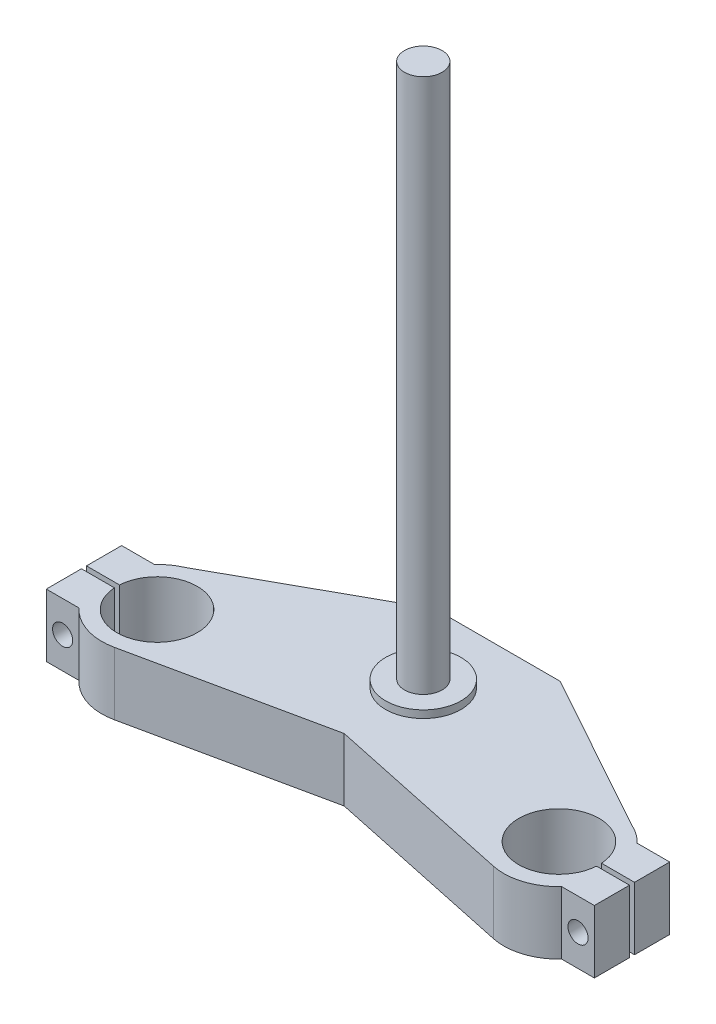
ISO-10303-21;
HEADER;
FILE_DESCRIPTION(('STEP AP214'),'2;1');
FILE_NAME('part.step','',(''),(''),'','','');
FILE_SCHEMA(('AUTOMOTIVE_DESIGN { 1 0 10303 214 1 1 1 1 }'));
ENDSEC;
DATA;
#1=APPLICATION_CONTEXT('core data for automotive mechanical design processes');
#2=APPLICATION_PROTOCOL_DEFINITION('international standard','automotive_design',2000,#1);
#3=PRODUCT_CONTEXT('',#1,'mechanical');
#4=PRODUCT('Part','Part','',(#3));
#5=PRODUCT_RELATED_PRODUCT_CATEGORY('part','',(#4));
#6=PRODUCT_DEFINITION_FORMATION('','',#4);
#7=PRODUCT_DEFINITION_CONTEXT('part definition',#1,'design');
#8=PRODUCT_DEFINITION('design','',#6,#7);
#9=PRODUCT_DEFINITION_SHAPE('','',#8);
#10=(LENGTH_UNIT() NAMED_UNIT(*) SI_UNIT(.MILLI.,.METRE.));
#11=(NAMED_UNIT(*) PLANE_ANGLE_UNIT() SI_UNIT($,.RADIAN.));
#12=(NAMED_UNIT(*) SI_UNIT($,.STERADIAN.) SOLID_ANGLE_UNIT());
#13=UNCERTAINTY_MEASURE_WITH_UNIT(LENGTH_MEASURE(1.E-05),#10,'distance_accuracy_value','');
#14=(GEOMETRIC_REPRESENTATION_CONTEXT(3) GLOBAL_UNCERTAINTY_ASSIGNED_CONTEXT((#13)) GLOBAL_UNIT_ASSIGNED_CONTEXT((#10,
#11,#12)) REPRESENTATION_CONTEXT('',''));
#15=CARTESIAN_POINT('',(0.,0.,0.));
#16=DIRECTION('',(0.,0.,1.));
#17=DIRECTION('',(1.,0.,0.));
#18=AXIS2_PLACEMENT_3D('',#15,#16,#17);
#19=CARTESIAN_POINT('',(-80.,25.,0.));
#20=DIRECTION('',(0.,-1.,0.));
#21=DIRECTION('',(0.,0.,-1.));
#22=AXIS2_PLACEMENT_3D('',#19,#20,#21);
#23=CYLINDRICAL_SURFACE('',#22,22.0085741456518);
#24=CARTESIAN_POINT('',(-80.,0.,0.));
#25=DIRECTION('',(0.,1.,0.));
#26=DIRECTION('',(0.,0.,1.));
#27=AXIS2_PLACEMENT_3D('',#24,#25,#26);
#28=CIRCLE('',#27,22.0085741456518);
#29=CARTESIAN_POINT('',(-96.105195929409,0.,15.));
#30=VERTEX_POINT('',#29);
#31=CARTESIAN_POINT('',(-75.4253251607116,0.,21.5278815966512));
#32=VERTEX_POINT('',#31);
#33=EDGE_CURVE('E232',#30,#32,#28,.T.);
#34=ORIENTED_EDGE('',*,*,#33,.T.);
#35=DIRECTION('',(0.,-1.,0.));
#36=VECTOR('',#35,1.);
#37=CARTESIAN_POINT('',(-75.4253251607116,25.,21.5278815966512));
#38=LINE('',#37,#36);
#39=CARTESIAN_POINT('',(-75.4253251607116,25.,21.5278815966512));
#40=VERTEX_POINT('',#39);
#41=EDGE_CURVE('E13',#40,#32,#38,.T.);
#42=ORIENTED_EDGE('',*,*,#41,.F.);
#43=CARTESIAN_POINT('',(-80.,25.,0.));
#44=DIRECTION('',(0.,1.,0.));
#45=DIRECTION('',(0.,0.,1.));
#46=AXIS2_PLACEMENT_3D('',#43,#44,#45);
#47=CIRCLE('',#46,22.0085741456518);
#48=CARTESIAN_POINT('',(-96.105195929409,25.,15.));
#49=VERTEX_POINT('',#48);
#50=EDGE_CURVE('E278',#49,#40,#47,.T.);
#51=ORIENTED_EDGE('',*,*,#50,.F.);
#52=DIRECTION('',(0.,-1.,0.));
#53=VECTOR('',#52,1.);
#54=CARTESIAN_POINT('',(-96.105195929409,25.,15.));
#55=LINE('',#54,#53);
#56=EDGE_CURVE('E228',#49,#30,#55,.T.);
#57=ORIENTED_EDGE('',*,*,#56,.T.);
#58=EDGE_LOOP('',(#34,#42,#51,#57));
#59=FACE_BOUND('',#58,.T.);
#60=ADVANCED_FACE('F46',(#59),#23,.T.);
#61=CARTESIAN_POINT('',(-75.4253251607116,25.,21.5278815966512));
#62=DIRECTION('',(-0.207858755820045,0.,-0.978158850917857));
#63=DIRECTION('',(-0.978158850917857,0.,0.207858755820045));
#64=AXIS2_PLACEMENT_3D('',#61,#62,#63);
#65=PLANE('',#64);
#66=DIRECTION('',(0.978158850917857,0.,-0.207858755820045));
#67=VECTOR('',#66,1.);
#68=CARTESIAN_POINT('',(-75.4253251607116,0.,21.5278815966512));
#69=LINE('',#68,#67);
#70=CARTESIAN_POINT('',(0.,0.,5.5));
#71=VERTEX_POINT('',#70);
#72=EDGE_CURVE('E235',#32,#71,#69,.T.);
#73=ORIENTED_EDGE('',*,*,#72,.T.);
#74=DIRECTION('',(0.,-1.,0.));
#75=VECTOR('',#74,1.);
#76=CARTESIAN_POINT('',(0.,25.,5.5));
#77=LINE('',#76,#75);
#78=CARTESIAN_POINT('',(0.,25.,5.5));
#79=VERTEX_POINT('',#78);
#80=EDGE_CURVE('E54',#79,#71,#77,.T.);
#81=ORIENTED_EDGE('',*,*,#80,.F.);
#82=DIRECTION('',(0.978158850917857,0.,-0.207858755820045));
#83=VECTOR('',#82,1.);
#84=CARTESIAN_POINT('',(-75.4253251607116,25.,21.5278815966512));
#85=LINE('',#84,#83);
#86=EDGE_CURVE('E150',#40,#79,#85,.T.);
#87=ORIENTED_EDGE('',*,*,#86,.F.);
#88=ORIENTED_EDGE('',*,*,#41,.T.);
#89=EDGE_LOOP('',(#73,#81,#87,#88));
#90=FACE_BOUND('',#89,.T.);
#91=ADVANCED_FACE('F414',(#90),#65,.F.);
#92=CARTESIAN_POINT('',(75.4253251607116,25.,21.5278815966512));
#93=DIRECTION('',(0.207858755820045,0.,-0.978158850917857));
#94=DIRECTION('',(-0.978158850917857,0.,-0.207858755820045));
#95=AXIS2_PLACEMENT_3D('',#92,#93,#94);
#96=PLANE('',#95);
#97=DIRECTION('',(0.978158850917857,0.,0.207858755820045));
#98=VECTOR('',#97,1.);
#99=CARTESIAN_POINT('',(75.4253251607116,0.,21.5278815966512));
#100=LINE('',#99,#98);
#101=CARTESIAN_POINT('',(75.4253251607116,0.,21.5278815966512));
#102=VERTEX_POINT('',#101);
#103=EDGE_CURVE('E238',#71,#102,#100,.T.);
#104=ORIENTED_EDGE('',*,*,#103,.T.);
#105=DIRECTION('',(0.,-1.,0.));
#106=VECTOR('',#105,1.);
#107=CARTESIAN_POINT('',(75.4253251607116,25.,21.5278815966512));
#108=LINE('',#107,#106);
#109=CARTESIAN_POINT('',(75.4253251607116,25.,21.5278815966512));
#110=VERTEX_POINT('',#109);
#111=EDGE_CURVE('E330',#110,#102,#108,.T.);
#112=ORIENTED_EDGE('',*,*,#111,.F.);
#113=DIRECTION('',(0.978158850917857,0.,0.207858755820045));
#114=VECTOR('',#113,1.);
#115=CARTESIAN_POINT('',(75.4253251607116,25.,21.5278815966512));
#116=LINE('',#115,#114);
#117=EDGE_CURVE('E338',#79,#110,#116,.T.);
#118=ORIENTED_EDGE('',*,*,#117,.F.);
#119=ORIENTED_EDGE('',*,*,#80,.T.);
#120=EDGE_LOOP('',(#104,#112,#118,#119));
#121=FACE_BOUND('',#120,.T.);
#122=ADVANCED_FACE('F336',(#121),#96,.F.);
#123=CARTESIAN_POINT('',(80.,25.,0.));
#124=DIRECTION('',(0.,-1.,0.));
#125=DIRECTION('',(0.,0.,-1.));
#126=AXIS2_PLACEMENT_3D('',#123,#124,#125);
#127=CYLINDRICAL_SURFACE('',#126,22.0085741456518);
#128=CARTESIAN_POINT('',(80.,0.,0.));
#129=DIRECTION('',(0.,1.,0.));
#130=DIRECTION('',(0.,0.,-1.));
#131=AXIS2_PLACEMENT_3D('',#128,#129,#130);
#132=CIRCLE('',#131,22.0085741456518);
#133=CARTESIAN_POINT('',(96.105195929409,0.,15.));
#134=VERTEX_POINT('',#133);
#135=EDGE_CURVE('E240',#102,#134,#132,.T.);
#136=ORIENTED_EDGE('',*,*,#135,.T.);
#137=DIRECTION('',(0.,-1.,0.));
#138=VECTOR('',#137,1.);
#139=CARTESIAN_POINT('',(96.105195929409,25.,15.));
#140=LINE('',#139,#138);
#141=CARTESIAN_POINT('',(96.105195929409,25.,15.));
#142=VERTEX_POINT('',#141);
#143=EDGE_CURVE('E327',#142,#134,#140,.T.);
#144=ORIENTED_EDGE('',*,*,#143,.F.);
#145=CARTESIAN_POINT('',(80.,25.,0.));
#146=DIRECTION('',(0.,1.,0.));
#147=DIRECTION('',(0.,0.,-1.));
#148=AXIS2_PLACEMENT_3D('',#145,#146,#147);
#149=CIRCLE('',#148,22.0085741456518);
#150=EDGE_CURVE('E356',#110,#142,#149,.T.);
#151=ORIENTED_EDGE('',*,*,#150,.F.);
#152=ORIENTED_EDGE('',*,*,#111,.T.);
#153=EDGE_LOOP('',(#136,#144,#151,#152));
#154=FACE_BOUND('',#153,.T.);
#155=ADVANCED_FACE('F347',(#154),#127,.T.);
#156=CARTESIAN_POINT('',(109.105195929409,25.,15.));
#157=DIRECTION('',(0.,0.,-1.));
#158=DIRECTION('',(-1.,0.,0.));
#159=AXIS2_PLACEMENT_3D('',#156,#157,#158);
#160=PLANE('',#159);
#161=CARTESIAN_POINT('',(102.605195929409,12.5,15.));
#162=DIRECTION('',(0.,0.,1.));
#163=DIRECTION('',(-1.,0.,0.));
#164=AXIS2_PLACEMENT_3D('',#161,#162,#163);
#165=CIRCLE('',#164,4.00000000000001);
#166=CARTESIAN_POINT('',(98.605195929409,12.5,15.));
#167=VERTEX_POINT('',#166);
#168=EDGE_CURVE('E512',#167,#167,#165,.T.);
#169=ORIENTED_EDGE('',*,*,#168,.F.);
#170=EDGE_LOOP('',(#169));
#171=FACE_BOUND('',#170,.T.);
#172=DIRECTION('',(1.,0.,0.));
#173=VECTOR('',#172,1.);
#174=CARTESIAN_POINT('',(109.105195929409,0.,15.));
#175=LINE('',#174,#173);
#176=CARTESIAN_POINT('',(109.105195929409,0.,15.));
#177=VERTEX_POINT('',#176);
#178=EDGE_CURVE('E242',#134,#177,#175,.T.);
#179=ORIENTED_EDGE('',*,*,#178,.T.);
#180=DIRECTION('',(0.,-1.,0.));
#181=VECTOR('',#180,1.);
#182=CARTESIAN_POINT('',(109.105195929409,25.,15.));
#183=LINE('',#182,#181);
#184=CARTESIAN_POINT('',(109.105195929409,25.,15.));
#185=VERTEX_POINT('',#184);
#186=EDGE_CURVE('E324',#185,#177,#183,.T.);
#187=ORIENTED_EDGE('',*,*,#186,.F.);
#188=DIRECTION('',(1.,0.,0.));
#189=VECTOR('',#188,1.);
#190=CARTESIAN_POINT('',(109.105195929409,25.,15.));
#191=LINE('',#190,#189);
#192=EDGE_CURVE('E353',#142,#185,#191,.T.);
#193=ORIENTED_EDGE('',*,*,#192,.F.);
#194=ORIENTED_EDGE('',*,*,#143,.T.);
#195=EDGE_LOOP('',(#179,#187,#193,#194));
#196=FACE_BOUND('',#195,.T.);
#197=ADVANCED_FACE('F351',(#171,#196),#160,.F.);
#198=CARTESIAN_POINT('',(109.105195929409,25.,0.999999999999994));
#199=DIRECTION('',(-1.,0.,0.));
#200=DIRECTION('',(0.,0.,1.));
#201=AXIS2_PLACEMENT_3D('',#198,#199,#200);
#202=PLANE('',#201);
#203=DIRECTION('',(0.,0.,-1.));
#204=VECTOR('',#203,1.);
#205=CARTESIAN_POINT('',(109.105195929409,0.,0.999999999999994));
#206=LINE('',#205,#204);
#207=CARTESIAN_POINT('',(109.105195929409,0.,0.999999999999994));
#208=VERTEX_POINT('',#207);
#209=EDGE_CURVE('E244',#177,#208,#206,.T.);
#210=ORIENTED_EDGE('',*,*,#209,.T.);
#211=DIRECTION('',(0.,-1.,0.));
#212=VECTOR('',#211,1.);
#213=CARTESIAN_POINT('',(109.105195929409,25.,0.999999999999994));
#214=LINE('',#213,#212);
#215=CARTESIAN_POINT('',(109.105195929409,25.,0.999999999999994));
#216=VERTEX_POINT('',#215);
#217=EDGE_CURVE('E321',#216,#208,#214,.T.);
#218=ORIENTED_EDGE('',*,*,#217,.F.);
#219=DIRECTION('',(0.,0.,-1.));
#220=VECTOR('',#219,1.);
#221=CARTESIAN_POINT('',(109.105195929409,25.,0.999999999999994));
#222=LINE('',#221,#220);
#223=EDGE_CURVE('E355',#185,#216,#222,.T.);
#224=ORIENTED_EDGE('',*,*,#223,.F.);
#225=ORIENTED_EDGE('',*,*,#186,.T.);
#226=EDGE_LOOP('',(#210,#218,#224,#225));
#227=FACE_BOUND('',#226,.T.);
#228=ADVANCED_FACE('F427',(#227),#202,.F.);
#229=CARTESIAN_POINT('',(109.105195929409,25.,0.999999999999994));
#230=DIRECTION('',(0.,0.,1.));
#231=DIRECTION('',(1.,0.,0.));
#232=AXIS2_PLACEMENT_3D('',#229,#230,#231);
#233=PLANE('',#232);
#234=CARTESIAN_POINT('',(102.605195929409,12.5,0.999999999999994));
#235=DIRECTION('',(0.,0.,1.));
#236=DIRECTION('',(1.,0.,0.));
#237=AXIS2_PLACEMENT_3D('',#234,#235,#236);
#238=CIRCLE('',#237,4.00000000000001);
#239=CARTESIAN_POINT('',(106.605195929409,12.5,0.999999999999994));
#240=VERTEX_POINT('',#239);
#241=EDGE_CURVE('E504',#240,#240,#238,.T.);
#242=ORIENTED_EDGE('',*,*,#241,.T.);
#243=EDGE_LOOP('',(#242));
#244=FACE_BOUND('',#243,.T.);
#245=DIRECTION('',(-1.,0.,0.));
#246=VECTOR('',#245,1.);
#247=CARTESIAN_POINT('',(109.105195929409,0.,0.999999999999994));
#248=LINE('',#247,#246);
#249=CARTESIAN_POINT('',(95.9687194226713,0.,0.999999999999994));
#250=VERTEX_POINT('',#249);
#251=EDGE_CURVE('E246',#208,#250,#248,.T.);
#252=ORIENTED_EDGE('',*,*,#251,.T.);
#253=DIRECTION('',(0.,-1.,0.));
#254=VECTOR('',#253,1.);
#255=CARTESIAN_POINT('',(95.9687194226713,25.,0.999999999999994));
#256=LINE('',#255,#254);
#257=CARTESIAN_POINT('',(95.9687194226713,25.,0.999999999999994));
#258=VERTEX_POINT('',#257);
#259=EDGE_CURVE('E318',#258,#250,#256,.T.);
#260=ORIENTED_EDGE('',*,*,#259,.F.);
#261=DIRECTION('',(-1.,0.,0.));
#262=VECTOR('',#261,1.);
#263=CARTESIAN_POINT('',(109.105195929409,25.,0.999999999999994));
#264=LINE('',#263,#262);
#265=EDGE_CURVE('E358',#216,#258,#264,.T.);
#266=ORIENTED_EDGE('',*,*,#265,.F.);
#267=ORIENTED_EDGE('',*,*,#217,.T.);
#268=EDGE_LOOP('',(#252,#260,#266,#267));
#269=FACE_BOUND('',#268,.T.);
#270=ADVANCED_FACE('F431',(#244,#269),#233,.F.);
#271=CARTESIAN_POINT('',(80.,25.,0.));
#272=DIRECTION('',(0.,-1.,0.));
#273=DIRECTION('',(0.,0.,-1.));
#274=AXIS2_PLACEMENT_3D('',#271,#272,#273);
#275=CYLINDRICAL_SURFACE('',#274,16.);
#276=CARTESIAN_POINT('',(80.,0.,0.));
#277=DIRECTION('',(0.,-1.,0.));
#278=DIRECTION('',(0.,0.,-1.));
#279=AXIS2_PLACEMENT_3D('',#276,#277,#278);
#280=CIRCLE('',#279,16.);
#281=CARTESIAN_POINT('',(95.9687194226713,0.,-0.999999999999995));
#282=VERTEX_POINT('',#281);
#283=EDGE_CURVE('E248',#250,#282,#280,.T.);
#284=ORIENTED_EDGE('',*,*,#283,.T.);
#285=DIRECTION('',(0.,-1.,0.));
#286=VECTOR('',#285,1.);
#287=CARTESIAN_POINT('',(95.9687194226713,25.,-0.999999999999995));
#288=LINE('',#287,#286);
#289=CARTESIAN_POINT('',(95.9687194226713,25.,-0.999999999999995));
#290=VERTEX_POINT('',#289);
#291=EDGE_CURVE('E315',#290,#282,#288,.T.);
#292=ORIENTED_EDGE('',*,*,#291,.F.);
#293=CARTESIAN_POINT('',(80.,25.,0.));
#294=DIRECTION('',(0.,-1.,0.));
#295=DIRECTION('',(0.,0.,-1.));
#296=AXIS2_PLACEMENT_3D('',#293,#294,#295);
#297=CIRCLE('',#296,16.);
#298=EDGE_CURVE('E364',#258,#290,#297,.T.);
#299=ORIENTED_EDGE('',*,*,#298,.F.);
#300=ORIENTED_EDGE('',*,*,#259,.T.);
#301=EDGE_LOOP('',(#284,#292,#299,#300));
#302=FACE_BOUND('',#301,.T.);
#303=ADVANCED_FACE('F435',(#302),#275,.F.);
#304=CARTESIAN_POINT('',(109.105195929409,25.,-0.999999999999994));
#305=DIRECTION('',(0.,0.,-1.));
#306=DIRECTION('',(-1.,0.,0.));
#307=AXIS2_PLACEMENT_3D('',#304,#305,#306);
#308=PLANE('',#307);
#309=CARTESIAN_POINT('',(102.605195929409,12.5,-0.999999999999994));
#310=DIRECTION('',(0.,0.,-1.));
#311=DIRECTION('',(-1.,0.,0.));
#312=AXIS2_PLACEMENT_3D('',#309,#310,#311);
#313=CIRCLE('',#312,4.00000000000001);
#314=CARTESIAN_POINT('',(98.605195929409,12.5,-0.999999999999994));
#315=VERTEX_POINT('',#314);
#316=EDGE_CURVE('E508',#315,#315,#313,.T.);
#317=ORIENTED_EDGE('',*,*,#316,.T.);
#318=EDGE_LOOP('',(#317));
#319=FACE_BOUND('',#318,.T.);
#320=DIRECTION('',(1.,0.,0.));
#321=VECTOR('',#320,1.);
#322=CARTESIAN_POINT('',(109.105195929409,0.,-0.999999999999994));
#323=LINE('',#322,#321);
#324=CARTESIAN_POINT('',(109.105195929409,0.,-0.999999999999994));
#325=VERTEX_POINT('',#324);
#326=EDGE_CURVE('E250',#282,#325,#323,.T.);
#327=ORIENTED_EDGE('',*,*,#326,.T.);
#328=DIRECTION('',(0.,-1.,0.));
#329=VECTOR('',#328,1.);
#330=CARTESIAN_POINT('',(109.105195929409,25.,-0.999999999999994));
#331=LINE('',#330,#329);
#332=CARTESIAN_POINT('',(109.105195929409,25.,-0.999999999999994));
#333=VERTEX_POINT('',#332);
#334=EDGE_CURVE('E312',#333,#325,#331,.T.);
#335=ORIENTED_EDGE('',*,*,#334,.F.);
#336=DIRECTION('',(1.,0.,0.));
#337=VECTOR('',#336,1.);
#338=CARTESIAN_POINT('',(109.105195929409,25.,-0.999999999999994));
#339=LINE('',#338,#337);
#340=EDGE_CURVE('E366',#290,#333,#339,.T.);
#341=ORIENTED_EDGE('',*,*,#340,.F.);
#342=ORIENTED_EDGE('',*,*,#291,.T.);
#343=EDGE_LOOP('',(#327,#335,#341,#342));
#344=FACE_BOUND('',#343,.T.);
#345=ADVANCED_FACE('F439',(#319,#344),#308,.F.);
#346=CARTESIAN_POINT('',(109.105195929409,25.,-0.999999999999994));
#347=DIRECTION('',(-1.,0.,0.));
#348=DIRECTION('',(0.,0.,1.));
#349=AXIS2_PLACEMENT_3D('',#346,#347,#348);
#350=PLANE('',#349);
#351=DIRECTION('',(0.,0.,-1.));
#352=VECTOR('',#351,1.);
#353=CARTESIAN_POINT('',(109.105195929409,0.,-0.999999999999994));
#354=LINE('',#353,#352);
#355=CARTESIAN_POINT('',(109.105195929409,0.,-15.));
#356=VERTEX_POINT('',#355);
#357=EDGE_CURVE('E252',#325,#356,#354,.T.);
#358=ORIENTED_EDGE('',*,*,#357,.T.);
#359=DIRECTION('',(0.,-1.,0.));
#360=VECTOR('',#359,1.);
#361=CARTESIAN_POINT('',(109.105195929409,25.,-15.));
#362=LINE('',#361,#360);
#363=CARTESIAN_POINT('',(109.105195929409,25.,-15.));
#364=VERTEX_POINT('',#363);
#365=EDGE_CURVE('E309',#364,#356,#362,.T.);
#366=ORIENTED_EDGE('',*,*,#365,.F.);
#367=DIRECTION('',(0.,0.,-1.));
#368=VECTOR('',#367,1.);
#369=CARTESIAN_POINT('',(109.105195929409,25.,-0.999999999999994));
#370=LINE('',#369,#368);
#371=EDGE_CURVE('E368',#333,#364,#370,.T.);
#372=ORIENTED_EDGE('',*,*,#371,.F.);
#373=ORIENTED_EDGE('',*,*,#334,.T.);
#374=EDGE_LOOP('',(#358,#366,#372,#373));
#375=FACE_BOUND('',#374,.T.);
#376=ADVANCED_FACE('F443',(#375),#350,.F.);
#377=CARTESIAN_POINT('',(109.105195929409,25.,-15.));
#378=DIRECTION('',(0.,0.,1.));
#379=DIRECTION('',(1.,0.,0.));
#380=AXIS2_PLACEMENT_3D('',#377,#378,#379);
#381=PLANE('',#380);
#382=CARTESIAN_POINT('',(102.605195929409,12.5,-15.));
#383=DIRECTION('',(0.,0.,1.));
#384=DIRECTION('',(-1.,0.,0.));
#385=AXIS2_PLACEMENT_3D('',#382,#383,#384);
#386=CIRCLE('',#385,4.00000000000001);
#387=CARTESIAN_POINT('',(98.605195929409,12.5,-15.));
#388=VERTEX_POINT('',#387);
#389=EDGE_CURVE('E511',#388,#388,#386,.T.);
#390=ORIENTED_EDGE('',*,*,#389,.T.);
#391=EDGE_LOOP('',(#390));
#392=FACE_BOUND('',#391,.T.);
#393=DIRECTION('',(-1.,0.,0.));
#394=VECTOR('',#393,1.);
#395=CARTESIAN_POINT('',(109.105195929409,0.,-15.));
#396=LINE('',#395,#394);
#397=CARTESIAN_POINT('',(96.105195929409,0.,-15.));
#398=VERTEX_POINT('',#397);
#399=EDGE_CURVE('E254',#356,#398,#396,.T.);
#400=ORIENTED_EDGE('',*,*,#399,.T.);
#401=DIRECTION('',(0.,-1.,0.));
#402=VECTOR('',#401,1.);
#403=CARTESIAN_POINT('',(96.105195929409,25.,-15.));
#404=LINE('',#403,#402);
#405=CARTESIAN_POINT('',(96.105195929409,25.,-15.));
#406=VERTEX_POINT('',#405);
#407=EDGE_CURVE('E306',#406,#398,#404,.T.);
#408=ORIENTED_EDGE('',*,*,#407,.F.);
#409=DIRECTION('',(-1.,0.,0.));
#410=VECTOR('',#409,1.);
#411=CARTESIAN_POINT('',(109.105195929409,25.,-15.));
#412=LINE('',#411,#410);
#413=EDGE_CURVE('E370',#364,#406,#412,.T.);
#414=ORIENTED_EDGE('',*,*,#413,.F.);
#415=ORIENTED_EDGE('',*,*,#365,.T.);
#416=EDGE_LOOP('',(#400,#408,#414,#415));
#417=FACE_BOUND('',#416,.T.);
#418=ADVANCED_FACE('F447',(#392,#417),#381,.F.);
#419=CARTESIAN_POINT('',(80.,25.,0.));
#420=DIRECTION('',(0.,-1.,0.));
#421=DIRECTION('',(0.,0.,-1.));
#422=AXIS2_PLACEMENT_3D('',#419,#420,#421);
#423=CYLINDRICAL_SURFACE('',#422,22.0085741456518);
#424=CARTESIAN_POINT('',(80.,0.,0.));
#425=DIRECTION('',(0.,1.,0.));
#426=DIRECTION('',(0.,0.,-1.));
#427=AXIS2_PLACEMENT_3D('',#424,#425,#426);
#428=CIRCLE('',#427,22.0085741456518);
#429=CARTESIAN_POINT('',(88.7820477036929,0.,-20.180509757058));
#430=VERTEX_POINT('',#429);
#431=EDGE_CURVE('E256',#398,#430,#428,.T.);
#432=ORIENTED_EDGE('',*,*,#431,.T.);
#433=DIRECTION('',(0.,-1.,0.));
#434=VECTOR('',#433,1.);
#435=CARTESIAN_POINT('',(88.7820477036929,25.,-20.180509757058));
#436=LINE('',#435,#434);
#437=CARTESIAN_POINT('',(88.7820477036929,25.,-20.180509757058));
#438=VERTEX_POINT('',#437);
#439=EDGE_CURVE('E303',#438,#430,#436,.T.);
#440=ORIENTED_EDGE('',*,*,#439,.F.);
#441=CARTESIAN_POINT('',(80.,25.,0.));
#442=DIRECTION('',(0.,1.,0.));
#443=DIRECTION('',(0.,0.,-1.));
#444=AXIS2_PLACEMENT_3D('',#441,#442,#443);
#445=CIRCLE('',#444,22.0085741456518);
#446=EDGE_CURVE('E372',#406,#438,#445,.T.);
#447=ORIENTED_EDGE('',*,*,#446,.F.);
#448=ORIENTED_EDGE('',*,*,#407,.T.);
#449=EDGE_LOOP('',(#432,#440,#447,#448));
#450=FACE_BOUND('',#449,.T.);
#451=ADVANCED_FACE('F451',(#450),#423,.T.);
#452=CARTESIAN_POINT('',(25.,25.,-55.5));
#453=DIRECTION('',(-0.484437357953598,0.,0.874825951957838));
#454=DIRECTION('',(0.874825951957838,0.,0.484437357953598));
#455=AXIS2_PLACEMENT_3D('',#452,#453,#454);
#456=PLANE('',#455);
#457=DIRECTION('',(-0.874825951957838,0.,-0.484437357953597));
#458=VECTOR('',#457,1.);
#459=CARTESIAN_POINT('',(25.,0.,-55.5));
#460=LINE('',#459,#458);
#461=CARTESIAN_POINT('',(25.,0.,-55.5));
#462=VERTEX_POINT('',#461);
#463=EDGE_CURVE('E258',#430,#462,#460,.T.);
#464=ORIENTED_EDGE('',*,*,#463,.T.);
#465=DIRECTION('',(0.,-1.,0.));
#466=VECTOR('',#465,1.);
#467=CARTESIAN_POINT('',(25.,25.,-55.5));
#468=LINE('',#467,#466);
#469=CARTESIAN_POINT('',(25.,25.,-55.5));
#470=VERTEX_POINT('',#469);
#471=EDGE_CURVE('E300',#470,#462,#468,.T.);
#472=ORIENTED_EDGE('',*,*,#471,.F.);
#473=DIRECTION('',(-0.874825951957838,0.,-0.484437357953597));
#474=VECTOR('',#473,1.);
#475=CARTESIAN_POINT('',(25.,25.,-55.5));
#476=LINE('',#475,#474);
#477=EDGE_CURVE('E374',#438,#470,#476,.T.);
#478=ORIENTED_EDGE('',*,*,#477,.F.);
#479=ORIENTED_EDGE('',*,*,#439,.T.);
#480=EDGE_LOOP('',(#464,#472,#478,#479));
#481=FACE_BOUND('',#480,.T.);
#482=ADVANCED_FACE('F455',(#481),#456,.F.);
#483=CARTESIAN_POINT('',(-0.999999999999995,25.,-55.5));
#484=DIRECTION('',(0.,0.,1.));
#485=DIRECTION('',(1.,0.,0.));
#486=AXIS2_PLACEMENT_3D('',#483,#484,#485);
#487=PLANE('',#486);
#488=DIRECTION('',(-1.,0.,0.));
#489=VECTOR('',#488,1.);
#490=CARTESIAN_POINT('',(-0.999999999999995,0.,-55.5));
#491=LINE('',#490,#489);
#492=CARTESIAN_POINT('',(-25.,0.,-55.5));
#493=VERTEX_POINT('',#492);
#494=EDGE_CURVE('E261',#462,#493,#491,.T.);
#495=ORIENTED_EDGE('',*,*,#494,.T.);
#496=DIRECTION('',(0.,-1.,0.));
#497=VECTOR('',#496,1.);
#498=CARTESIAN_POINT('',(-25.,25.,-55.5));
#499=LINE('',#498,#497);
#500=CARTESIAN_POINT('',(-25.,25.,-55.5));
#501=VERTEX_POINT('',#500);
#502=EDGE_CURVE('E297',#501,#493,#499,.T.);
#503=ORIENTED_EDGE('',*,*,#502,.F.);
#504=DIRECTION('',(-1.,0.,0.));
#505=VECTOR('',#504,1.);
#506=CARTESIAN_POINT('',(25.,25.,-55.5));
#507=LINE('',#506,#505);
#508=EDGE_CURVE('E376',#470,#501,#507,.T.);
#509=ORIENTED_EDGE('',*,*,#508,.F.);
#510=ORIENTED_EDGE('',*,*,#471,.T.);
#511=EDGE_LOOP('',(#495,#503,#509,#510));
#512=FACE_BOUND('',#511,.T.);
#513=ADVANCED_FACE('F459',(#512),#487,.F.);
#514=CARTESIAN_POINT('',(-25.,25.,-55.5));
#515=DIRECTION('',(0.484437357953598,0.,0.874825951957838));
#516=DIRECTION('',(0.874825951957838,0.,-0.484437357953598));
#517=AXIS2_PLACEMENT_3D('',#514,#515,#516);
#518=PLANE('',#517);
#519=DIRECTION('',(-0.874825951957838,0.,0.484437357953597));
#520=VECTOR('',#519,1.);
#521=CARTESIAN_POINT('',(-25.,0.,-55.5));
#522=LINE('',#521,#520);
#523=CARTESIAN_POINT('',(-88.7820477036929,0.,-20.180509757058));
#524=VERTEX_POINT('',#523);
#525=EDGE_CURVE('E263',#493,#524,#522,.T.);
#526=ORIENTED_EDGE('',*,*,#525,.T.);
#527=DIRECTION('',(0.,-1.,0.));
#528=VECTOR('',#527,1.);
#529=CARTESIAN_POINT('',(-88.7820477036929,25.,-20.180509757058));
#530=LINE('',#529,#528);
#531=CARTESIAN_POINT('',(-88.7820477036929,25.,-20.180509757058));
#532=VERTEX_POINT('',#531);
#533=EDGE_CURVE('E294',#532,#524,#530,.T.);
#534=ORIENTED_EDGE('',*,*,#533,.F.);
#535=DIRECTION('',(-0.874825951957838,0.,0.484437357953597));
#536=VECTOR('',#535,1.);
#537=CARTESIAN_POINT('',(-25.,25.,-55.5));
#538=LINE('',#537,#536);
#539=EDGE_CURVE('E378',#501,#532,#538,.T.);
#540=ORIENTED_EDGE('',*,*,#539,.F.);
#541=ORIENTED_EDGE('',*,*,#502,.T.);
#542=EDGE_LOOP('',(#526,#534,#540,#541));
#543=FACE_BOUND('',#542,.T.);
#544=ADVANCED_FACE('F463',(#543),#518,.F.);
#545=CARTESIAN_POINT('',(-80.,25.,0.));
#546=DIRECTION('',(0.,-1.,0.));
#547=DIRECTION('',(0.,0.,-1.));
#548=AXIS2_PLACEMENT_3D('',#545,#546,#547);
#549=CYLINDRICAL_SURFACE('',#548,22.0085741456518);
#550=CARTESIAN_POINT('',(-80.,0.,0.));
#551=DIRECTION('',(0.,1.,0.));
#552=DIRECTION('',(0.,0.,1.));
#553=AXIS2_PLACEMENT_3D('',#550,#551,#552);
#554=CIRCLE('',#553,22.0085741456518);
#555=CARTESIAN_POINT('',(-96.105195929409,0.,-15.));
#556=VERTEX_POINT('',#555);
#557=EDGE_CURVE('E265',#524,#556,#554,.T.);
#558=ORIENTED_EDGE('',*,*,#557,.T.);
#559=DIRECTION('',(0.,-1.,0.));
#560=VECTOR('',#559,1.);
#561=CARTESIAN_POINT('',(-96.105195929409,25.,-15.));
#562=LINE('',#561,#560);
#563=CARTESIAN_POINT('',(-96.105195929409,25.,-15.));
#564=VERTEX_POINT('',#563);
#565=EDGE_CURVE('E291',#564,#556,#562,.T.);
#566=ORIENTED_EDGE('',*,*,#565,.F.);
#567=CARTESIAN_POINT('',(-80.,25.,0.));
#568=DIRECTION('',(0.,1.,0.));
#569=DIRECTION('',(0.,0.,1.));
#570=AXIS2_PLACEMENT_3D('',#567,#568,#569);
#571=CIRCLE('',#570,22.0085741456518);
#572=EDGE_CURVE('E380',#532,#564,#571,.T.);
#573=ORIENTED_EDGE('',*,*,#572,.F.);
#574=ORIENTED_EDGE('',*,*,#533,.T.);
#575=EDGE_LOOP('',(#558,#566,#573,#574));
#576=FACE_BOUND('',#575,.T.);
#577=ADVANCED_FACE('F467',(#576),#549,.T.);
#578=CARTESIAN_POINT('',(-109.105195929409,25.,-15.));
#579=DIRECTION('',(0.,0.,1.));
#580=DIRECTION('',(1.,0.,0.));
#581=AXIS2_PLACEMENT_3D('',#578,#579,#580);
#582=PLANE('',#581);
#583=CARTESIAN_POINT('',(-102.605195929409,12.5,-15.));
#584=DIRECTION('',(0.,0.,1.));
#585=DIRECTION('',(1.,0.,0.));
#586=AXIS2_PLACEMENT_3D('',#583,#584,#585);
#587=CIRCLE('',#586,4.00000000000001);
#588=CARTESIAN_POINT('',(-98.605195929409,12.5,-15.));
#589=VERTEX_POINT('',#588);
#590=EDGE_CURVE('E493',#589,#589,#587,.T.);
#591=ORIENTED_EDGE('',*,*,#590,.T.);
#592=EDGE_LOOP('',(#591));
#593=FACE_BOUND('',#592,.T.);
#594=DIRECTION('',(-1.,0.,0.));
#595=VECTOR('',#594,1.);
#596=CARTESIAN_POINT('',(-109.105195929409,0.,-15.));
#597=LINE('',#596,#595);
#598=CARTESIAN_POINT('',(-109.105195929409,0.,-15.));
#599=VERTEX_POINT('',#598);
#600=EDGE_CURVE('E267',#556,#599,#597,.T.);
#601=ORIENTED_EDGE('',*,*,#600,.T.);
#602=DIRECTION('',(0.,-1.,0.));
#603=VECTOR('',#602,1.);
#604=CARTESIAN_POINT('',(-109.105195929409,25.,-15.));
#605=LINE('',#604,#603);
#606=CARTESIAN_POINT('',(-109.105195929409,25.,-15.));
#607=VERTEX_POINT('',#606);
#608=EDGE_CURVE('E288',#607,#599,#605,.T.);
#609=ORIENTED_EDGE('',*,*,#608,.F.);
#610=DIRECTION('',(-1.,0.,0.));
#611=VECTOR('',#610,1.);
#612=CARTESIAN_POINT('',(-109.105195929409,25.,-15.));
#613=LINE('',#612,#611);
#614=EDGE_CURVE('E382',#564,#607,#613,.T.);
#615=ORIENTED_EDGE('',*,*,#614,.F.);
#616=ORIENTED_EDGE('',*,*,#565,.T.);
#617=EDGE_LOOP('',(#601,#609,#615,#616));
#618=FACE_BOUND('',#617,.T.);
#619=ADVANCED_FACE('F471',(#593,#618),#582,.F.);
#620=CARTESIAN_POINT('',(-109.105195929409,25.,-0.999999999999994));
#621=DIRECTION('',(1.,0.,0.));
#622=DIRECTION('',(0.,0.,-1.));
#623=AXIS2_PLACEMENT_3D('',#620,#621,#622);
#624=PLANE('',#623);
#625=DIRECTION('',(0.,0.,1.));
#626=VECTOR('',#625,1.);
#627=CARTESIAN_POINT('',(-109.105195929409,0.,-0.999999999999994));
#628=LINE('',#627,#626);
#629=CARTESIAN_POINT('',(-109.105195929409,0.,-0.999999999999994));
#630=VERTEX_POINT('',#629);
#631=EDGE_CURVE('E269',#599,#630,#628,.T.);
#632=ORIENTED_EDGE('',*,*,#631,.T.);
#633=DIRECTION('',(0.,-1.,0.));
#634=VECTOR('',#633,1.);
#635=CARTESIAN_POINT('',(-109.105195929409,25.,-0.999999999999994));
#636=LINE('',#635,#634);
#637=CARTESIAN_POINT('',(-109.105195929409,25.,-0.999999999999994));
#638=VERTEX_POINT('',#637);
#639=EDGE_CURVE('E285',#638,#630,#636,.T.);
#640=ORIENTED_EDGE('',*,*,#639,.F.);
#641=DIRECTION('',(0.,0.,1.));
#642=VECTOR('',#641,1.);
#643=CARTESIAN_POINT('',(-109.105195929409,25.,-0.999999999999994));
#644=LINE('',#643,#642);
#645=EDGE_CURVE('E384',#607,#638,#644,.T.);
#646=ORIENTED_EDGE('',*,*,#645,.F.);
#647=ORIENTED_EDGE('',*,*,#608,.T.);
#648=EDGE_LOOP('',(#632,#640,#646,#647));
#649=FACE_BOUND('',#648,.T.);
#650=ADVANCED_FACE('F475',(#649),#624,.F.);
#651=CARTESIAN_POINT('',(-109.105195929409,25.,-0.999999999999994));
#652=DIRECTION('',(0.,0.,-1.));
#653=DIRECTION('',(-1.,0.,0.));
#654=AXIS2_PLACEMENT_3D('',#651,#652,#653);
#655=PLANE('',#654);
#656=CARTESIAN_POINT('',(-102.605195929409,12.5,-0.999999999999994));
#657=DIRECTION('',(0.,0.,-1.));
#658=DIRECTION('',(-1.,0.,0.));
#659=AXIS2_PLACEMENT_3D('',#656,#657,#658);
#660=CIRCLE('',#659,4.00000000000001);
#661=CARTESIAN_POINT('',(-106.605195929409,12.5,-0.999999999999994));
#662=VERTEX_POINT('',#661);
#663=EDGE_CURVE('E236',#662,#662,#660,.T.);
#664=ORIENTED_EDGE('',*,*,#663,.T.);
#665=EDGE_LOOP('',(#664));
#666=FACE_BOUND('',#665,.T.);
#667=DIRECTION('',(1.,0.,0.));
#668=VECTOR('',#667,1.);
#669=CARTESIAN_POINT('',(-109.105195929409,0.,-0.999999999999994));
#670=LINE('',#669,#668);
#671=CARTESIAN_POINT('',(-95.9687194226713,0.,-0.999999999999994));
#672=VERTEX_POINT('',#671);
#673=EDGE_CURVE('E271',#630,#672,#670,.T.);
#674=ORIENTED_EDGE('',*,*,#673,.T.);
#675=DIRECTION('',(0.,-1.,0.));
#676=VECTOR('',#675,1.);
#677=CARTESIAN_POINT('',(-95.9687194226713,25.,-0.999999999999994));
#678=LINE('',#677,#676);
#679=CARTESIAN_POINT('',(-95.9687194226713,25.,-0.999999999999994));
#680=VERTEX_POINT('',#679);
#681=EDGE_CURVE('E282',#680,#672,#678,.T.);
#682=ORIENTED_EDGE('',*,*,#681,.F.);
#683=DIRECTION('',(1.,0.,0.));
#684=VECTOR('',#683,1.);
#685=CARTESIAN_POINT('',(-109.105195929409,25.,-0.999999999999994));
#686=LINE('',#685,#684);
#687=EDGE_CURVE('E386',#638,#680,#686,.T.);
#688=ORIENTED_EDGE('',*,*,#687,.F.);
#689=ORIENTED_EDGE('',*,*,#639,.T.);
#690=EDGE_LOOP('',(#674,#682,#688,#689));
#691=FACE_BOUND('',#690,.T.);
#692=ADVANCED_FACE('F392',(#666,#691),#655,.F.);
#693=CARTESIAN_POINT('',(-80.,25.,0.));
#694=DIRECTION('',(0.,-1.,0.));
#695=DIRECTION('',(0.,0.,-1.));
#696=AXIS2_PLACEMENT_3D('',#693,#694,#695);
#697=CYLINDRICAL_SURFACE('',#696,16.);
#698=CARTESIAN_POINT('',(-80.,0.,0.));
#699=DIRECTION('',(0.,-1.,0.));
#700=DIRECTION('',(0.,0.,1.));
#701=AXIS2_PLACEMENT_3D('',#698,#699,#700);
#702=CIRCLE('',#701,16.);
#703=CARTESIAN_POINT('',(-95.9687194226713,0.,0.999999999999992));
#704=VERTEX_POINT('',#703);
#705=EDGE_CURVE('E273',#672,#704,#702,.T.);
#706=ORIENTED_EDGE('',*,*,#705,.T.);
#707=DIRECTION('',(0.,-1.,0.));
#708=VECTOR('',#707,1.);
#709=CARTESIAN_POINT('',(-95.9687194226713,25.,0.999999999999992));
#710=LINE('',#709,#708);
#711=CARTESIAN_POINT('',(-95.9687194226713,25.,0.999999999999992));
#712=VERTEX_POINT('',#711);
#713=EDGE_CURVE('E223',#712,#704,#710,.T.);
#714=ORIENTED_EDGE('',*,*,#713,.F.);
#715=CARTESIAN_POINT('',(-80.,25.,0.));
#716=DIRECTION('',(0.,-1.,0.));
#717=DIRECTION('',(0.,0.,1.));
#718=AXIS2_PLACEMENT_3D('',#715,#716,#717);
#719=CIRCLE('',#718,16.);
#720=EDGE_CURVE('E214',#680,#712,#719,.T.);
#721=ORIENTED_EDGE('',*,*,#720,.F.);
#722=ORIENTED_EDGE('',*,*,#681,.T.);
#723=EDGE_LOOP('',(#706,#714,#721,#722));
#724=FACE_BOUND('',#723,.T.);
#725=ADVANCED_FACE('F396',(#724),#697,.F.);
#726=CARTESIAN_POINT('',(-109.105195929409,25.,0.999999999999994));
#727=DIRECTION('',(0.,0.,1.));
#728=DIRECTION('',(1.,0.,0.));
#729=AXIS2_PLACEMENT_3D('',#726,#727,#728);
#730=PLANE('',#729);
#731=CARTESIAN_POINT('',(-102.605195929409,12.5,0.999999999999994));
#732=DIRECTION('',(0.,0.,1.));
#733=DIRECTION('',(1.,0.,0.));
#734=AXIS2_PLACEMENT_3D('',#731,#732,#733);
#735=CIRCLE('',#734,4.00000000000001);
#736=CARTESIAN_POINT('',(-98.605195929409,12.5,0.999999999999994));
#737=VERTEX_POINT('',#736);
#738=EDGE_CURVE('E491',#737,#737,#735,.T.);
#739=ORIENTED_EDGE('',*,*,#738,.T.);
#740=EDGE_LOOP('',(#739));
#741=FACE_BOUND('',#740,.T.);
#742=DIRECTION('',(-1.,0.,0.));
#743=VECTOR('',#742,1.);
#744=CARTESIAN_POINT('',(-109.105195929409,0.,0.999999999999994));
#745=LINE('',#744,#743);
#746=CARTESIAN_POINT('',(-109.105195929409,0.,0.999999999999994));
#747=VERTEX_POINT('',#746);
#748=EDGE_CURVE('E222',#704,#747,#745,.T.);
#749=ORIENTED_EDGE('',*,*,#748,.T.);
#750=DIRECTION('',(0.,-1.,0.));
#751=VECTOR('',#750,1.);
#752=CARTESIAN_POINT('',(-109.105195929409,25.,0.999999999999994));
#753=LINE('',#752,#751);
#754=CARTESIAN_POINT('',(-109.105195929409,25.,0.999999999999994));
#755=VERTEX_POINT('',#754);
#756=EDGE_CURVE('E219',#755,#747,#753,.T.);
#757=ORIENTED_EDGE('',*,*,#756,.F.);
#758=DIRECTION('',(-1.,0.,0.));
#759=VECTOR('',#758,1.);
#760=CARTESIAN_POINT('',(-109.105195929409,25.,0.999999999999994));
#761=LINE('',#760,#759);
#762=EDGE_CURVE('E208',#712,#755,#761,.T.);
#763=ORIENTED_EDGE('',*,*,#762,.F.);
#764=ORIENTED_EDGE('',*,*,#713,.T.);
#765=EDGE_LOOP('',(#749,#757,#763,#764));
#766=FACE_BOUND('',#765,.T.);
#767=ADVANCED_FACE('F220',(#741,#766),#730,.F.);
#768=CARTESIAN_POINT('',(-109.105195929409,25.,0.999999999999994));
#769=DIRECTION('',(1.,0.,0.));
#770=DIRECTION('',(0.,0.,-1.));
#771=AXIS2_PLACEMENT_3D('',#768,#769,#770);
#772=PLANE('',#771);
#773=DIRECTION('',(0.,0.,1.));
#774=VECTOR('',#773,1.);
#775=CARTESIAN_POINT('',(-109.105195929409,0.,0.999999999999994));
#776=LINE('',#775,#774);
#777=CARTESIAN_POINT('',(-109.105195929409,0.,15.));
#778=VERTEX_POINT('',#777);
#779=EDGE_CURVE('E136',#747,#778,#776,.T.);
#780=ORIENTED_EDGE('',*,*,#779,.T.);
#781=DIRECTION('',(0.,-1.,0.));
#782=VECTOR('',#781,1.);
#783=CARTESIAN_POINT('',(-109.105195929409,25.,15.));
#784=LINE('',#783,#782);
#785=CARTESIAN_POINT('',(-109.105195929409,25.,15.));
#786=VERTEX_POINT('',#785);
#787=EDGE_CURVE('E224',#786,#778,#784,.T.);
#788=ORIENTED_EDGE('',*,*,#787,.F.);
#789=DIRECTION('',(0.,0.,1.));
#790=VECTOR('',#789,1.);
#791=CARTESIAN_POINT('',(-109.105195929409,25.,0.999999999999994));
#792=LINE('',#791,#790);
#793=EDGE_CURVE('E212',#755,#786,#792,.T.);
#794=ORIENTED_EDGE('',*,*,#793,.F.);
#795=ORIENTED_EDGE('',*,*,#756,.T.);
#796=EDGE_LOOP('',(#780,#788,#794,#795));
#797=FACE_BOUND('',#796,.T.);
#798=ADVANCED_FACE('F226',(#797),#772,.F.);
#799=CARTESIAN_POINT('',(-109.105195929409,25.,15.));
#800=DIRECTION('',(0.,0.,-1.));
#801=DIRECTION('',(-1.,0.,0.));
#802=AXIS2_PLACEMENT_3D('',#799,#800,#801);
#803=PLANE('',#802);
#804=CARTESIAN_POINT('',(-102.605195929409,12.5,15.));
#805=DIRECTION('',(0.,0.,1.));
#806=DIRECTION('',(1.,0.,0.));
#807=AXIS2_PLACEMENT_3D('',#804,#805,#806);
#808=CIRCLE('',#807,4.00000000000001);
#809=CARTESIAN_POINT('',(-98.605195929409,12.5,15.));
#810=VERTEX_POINT('',#809);
#811=EDGE_CURVE('E498',#810,#810,#808,.T.);
#812=ORIENTED_EDGE('',*,*,#811,.F.);
#813=EDGE_LOOP('',(#812));
#814=FACE_BOUND('',#813,.T.);
#815=DIRECTION('',(1.,0.,0.));
#816=VECTOR('',#815,1.);
#817=CARTESIAN_POINT('',(-109.105195929409,0.,15.));
#818=LINE('',#817,#816);
#819=EDGE_CURVE('E142',#778,#30,#818,.T.);
#820=ORIENTED_EDGE('',*,*,#819,.T.);
#821=ORIENTED_EDGE('',*,*,#56,.F.);
#822=DIRECTION('',(1.,0.,0.));
#823=VECTOR('',#822,1.);
#824=CARTESIAN_POINT('',(-109.105195929409,25.,15.));
#825=LINE('',#824,#823);
#826=EDGE_CURVE('E62',#786,#49,#825,.T.);
#827=ORIENTED_EDGE('',*,*,#826,.F.);
#828=ORIENTED_EDGE('',*,*,#787,.T.);
#829=EDGE_LOOP('',(#820,#821,#827,#828));
#830=FACE_BOUND('',#829,.T.);
#831=ADVANCED_FACE('F400',(#814,#830),#803,.F.);
#832=CARTESIAN_POINT('',(-80.,25.,0.));
#833=DIRECTION('',(0.,1.,0.));
#834=DIRECTION('',(0.,0.,1.));
#835=AXIS2_PLACEMENT_3D('',#832,#833,#834);
#836=PLANE('',#835);
#837=CARTESIAN_POINT('',(0.,25.,-26.));
#838=DIRECTION('',(0.,1.,0.));
#839=DIRECTION('',(0.,0.,1.));
#840=AXIS2_PLACEMENT_3D('',#837,#838,#839);
#841=CIRCLE('',#840,15.);
#842=CARTESIAN_POINT('',(0.,25.,-11.));
#843=VERTEX_POINT('',#842);
#844=EDGE_CURVE('E518',#843,#843,#841,.T.);
#845=ORIENTED_EDGE('',*,*,#844,.F.);
#846=EDGE_LOOP('',(#845));
#847=FACE_BOUND('',#846,.T.);
#848=ORIENTED_EDGE('',*,*,#50,.T.);
#849=ORIENTED_EDGE('',*,*,#86,.T.);
#850=ORIENTED_EDGE('',*,*,#117,.T.);
#851=ORIENTED_EDGE('',*,*,#150,.T.);
#852=ORIENTED_EDGE('',*,*,#192,.T.);
#853=ORIENTED_EDGE('',*,*,#223,.T.);
#854=ORIENTED_EDGE('',*,*,#265,.T.);
#855=ORIENTED_EDGE('',*,*,#298,.T.);
#856=ORIENTED_EDGE('',*,*,#340,.T.);
#857=ORIENTED_EDGE('',*,*,#371,.T.);
#858=ORIENTED_EDGE('',*,*,#413,.T.);
#859=ORIENTED_EDGE('',*,*,#446,.T.);
#860=ORIENTED_EDGE('',*,*,#477,.T.);
#861=ORIENTED_EDGE('',*,*,#508,.T.);
#862=ORIENTED_EDGE('',*,*,#539,.T.);
#863=ORIENTED_EDGE('',*,*,#572,.T.);
#864=ORIENTED_EDGE('',*,*,#614,.T.);
#865=ORIENTED_EDGE('',*,*,#645,.T.);
#866=ORIENTED_EDGE('',*,*,#687,.T.);
#867=ORIENTED_EDGE('',*,*,#720,.T.);
#868=ORIENTED_EDGE('',*,*,#762,.T.);
#869=ORIENTED_EDGE('',*,*,#793,.T.);
#870=ORIENTED_EDGE('',*,*,#826,.T.);
#871=EDGE_LOOP('',(#848,#849,#850,#851,#852,#853,#854,#855,#856,#857,#858,#859,#860,#861,#862,
#863,#864,#865,#866,#867,#868,#869,#870));
#872=FACE_BOUND('',#871,.T.);
#873=ADVANCED_FACE('F210',(#847,#872),#836,.T.);
#874=CARTESIAN_POINT('',(-80.,0.,0.));
#875=DIRECTION('',(0.,1.,0.));
#876=DIRECTION('',(0.,0.,1.));
#877=AXIS2_PLACEMENT_3D('',#874,#875,#876);
#878=PLANE('',#877);
#879=ORIENTED_EDGE('',*,*,#33,.F.);
#880=ORIENTED_EDGE('',*,*,#819,.F.);
#881=ORIENTED_EDGE('',*,*,#779,.F.);
#882=ORIENTED_EDGE('',*,*,#748,.F.);
#883=ORIENTED_EDGE('',*,*,#705,.F.);
#884=ORIENTED_EDGE('',*,*,#673,.F.);
#885=ORIENTED_EDGE('',*,*,#631,.F.);
#886=ORIENTED_EDGE('',*,*,#600,.F.);
#887=ORIENTED_EDGE('',*,*,#557,.F.);
#888=ORIENTED_EDGE('',*,*,#525,.F.);
#889=ORIENTED_EDGE('',*,*,#494,.F.);
#890=ORIENTED_EDGE('',*,*,#463,.F.);
#891=ORIENTED_EDGE('',*,*,#431,.F.);
#892=ORIENTED_EDGE('',*,*,#399,.F.);
#893=ORIENTED_EDGE('',*,*,#357,.F.);
#894=ORIENTED_EDGE('',*,*,#326,.F.);
#895=ORIENTED_EDGE('',*,*,#283,.F.);
#896=ORIENTED_EDGE('',*,*,#251,.F.);
#897=ORIENTED_EDGE('',*,*,#209,.F.);
#898=ORIENTED_EDGE('',*,*,#178,.F.);
#899=ORIENTED_EDGE('',*,*,#135,.F.);
#900=ORIENTED_EDGE('',*,*,#103,.F.);
#901=ORIENTED_EDGE('',*,*,#72,.F.);
#902=EDGE_LOOP('',(#879,#880,#881,#882,#883,#884,#885,#886,#887,#888,#889,#890,#891,#892,#893,
#894,#895,#896,#897,#898,#899,#900,#901));
#903=FACE_BOUND('',#902,.T.);
#904=ADVANCED_FACE('F342',(#903),#878,.F.);
#905=CARTESIAN_POINT('',(-102.605195929409,12.5,-15.));
#906=DIRECTION('',(0.,0.,1.));
#907=DIRECTION('',(1.,0.,0.));
#908=AXIS2_PLACEMENT_3D('',#905,#906,#907);
#909=CYLINDRICAL_SURFACE('',#908,4.00000000000001);
#910=ORIENTED_EDGE('',*,*,#811,.T.);
#911=EDGE_LOOP('',(#910));
#912=FACE_BOUND('',#911,.T.);
#913=ORIENTED_EDGE('',*,*,#738,.F.);
#914=EDGE_LOOP('',(#913));
#915=FACE_BOUND('',#914,.T.);
#916=ADVANCED_FACE('F559',(#912,#915),#909,.F.);
#917=ORIENTED_EDGE('',*,*,#590,.F.);
#918=EDGE_LOOP('',(#917));
#919=FACE_BOUND('',#918,.T.);
#920=ORIENTED_EDGE('',*,*,#663,.F.);
#921=EDGE_LOOP('',(#920));
#922=FACE_BOUND('',#921,.T.);
#923=ADVANCED_FACE('F557',(#919,#922),#909,.F.);
#924=CARTESIAN_POINT('',(102.605195929409,12.5,-15.));
#925=DIRECTION('',(0.,0.,1.));
#926=DIRECTION('',(1.,0.,0.));
#927=AXIS2_PLACEMENT_3D('',#924,#925,#926);
#928=CYLINDRICAL_SURFACE('',#927,4.00000000000001);
#929=ORIENTED_EDGE('',*,*,#389,.F.);
#930=EDGE_LOOP('',(#929));
#931=FACE_BOUND('',#930,.T.);
#932=ORIENTED_EDGE('',*,*,#316,.F.);
#933=EDGE_LOOP('',(#932));
#934=FACE_BOUND('',#933,.T.);
#935=ADVANCED_FACE('F553',(#931,#934),#928,.F.);
#936=ORIENTED_EDGE('',*,*,#168,.T.);
#937=EDGE_LOOP('',(#936));
#938=FACE_BOUND('',#937,.T.);
#939=ORIENTED_EDGE('',*,*,#241,.F.);
#940=EDGE_LOOP('',(#939));
#941=FACE_BOUND('',#940,.T.);
#942=ADVANCED_FACE('F547',(#938,#941),#928,.F.);
#943=CARTESIAN_POINT('',(0.,28.,-26.));
#944=DIRECTION('',(0.,-1.,0.));
#945=DIRECTION('',(0.,0.,-1.));
#946=AXIS2_PLACEMENT_3D('',#943,#944,#945);
#947=CYLINDRICAL_SURFACE('',#946,15.);
#948=CARTESIAN_POINT('',(0.,28.,-26.));
#949=DIRECTION('',(0.,1.,0.));
#950=DIRECTION('',(0.,0.,1.));
#951=AXIS2_PLACEMENT_3D('',#948,#949,#950);
#952=CIRCLE('',#951,15.);
#953=CARTESIAN_POINT('',(0.,28.,-11.));
#954=VERTEX_POINT('',#953);
#955=EDGE_CURVE('E515',#954,#954,#952,.T.);
#956=ORIENTED_EDGE('',*,*,#955,.F.);
#957=EDGE_LOOP('',(#956));
#958=FACE_BOUND('',#957,.T.);
#959=ORIENTED_EDGE('',*,*,#844,.T.);
#960=EDGE_LOOP('',(#959));
#961=FACE_BOUND('',#960,.T.);
#962=ADVANCED_FACE('F541',(#958,#961),#947,.T.);
#963=CARTESIAN_POINT('',(0.,28.,-26.));
#964=DIRECTION('',(0.,1.,0.));
#965=DIRECTION('',(0.,0.,1.));
#966=AXIS2_PLACEMENT_3D('',#963,#964,#965);
#967=PLANE('',#966);
#968=CARTESIAN_POINT('',(0.,28.,-26.));
#969=DIRECTION('',(0.,1.,0.));
#970=DIRECTION('',(0.,0.,1.));
#971=AXIS2_PLACEMENT_3D('',#968,#969,#970);
#972=CIRCLE('',#971,7.5);
#973=CARTESIAN_POINT('',(0.,28.,-18.5));
#974=VERTEX_POINT('',#973);
#975=EDGE_CURVE('E524',#974,#974,#972,.T.);
#976=ORIENTED_EDGE('',*,*,#975,.F.);
#977=EDGE_LOOP('',(#976));
#978=FACE_BOUND('',#977,.T.);
#979=ORIENTED_EDGE('',*,*,#955,.T.);
#980=EDGE_LOOP('',(#979));
#981=FACE_BOUND('',#980,.T.);
#982=ADVANCED_FACE('F535',(#978,#981),#967,.T.);
#983=CARTESIAN_POINT('',(0.,241.,-26.));
#984=DIRECTION('',(0.,-1.,0.));
#985=DIRECTION('',(0.,0.,-1.));
#986=AXIS2_PLACEMENT_3D('',#983,#984,#985);
#987=CYLINDRICAL_SURFACE('',#986,7.5);
#988=CARTESIAN_POINT('',(0.,241.,-26.));
#989=DIRECTION('',(0.,1.,0.));
#990=DIRECTION('',(0.,0.,1.));
#991=AXIS2_PLACEMENT_3D('',#988,#989,#990);
#992=CIRCLE('',#991,7.5);
#993=CARTESIAN_POINT('',(0.,241.,-18.5));
#994=VERTEX_POINT('',#993);
#995=EDGE_CURVE('E521',#994,#994,#992,.T.);
#996=ORIENTED_EDGE('',*,*,#995,.F.);
#997=EDGE_LOOP('',(#996));
#998=FACE_BOUND('',#997,.T.);
#999=ORIENTED_EDGE('',*,*,#975,.T.);
#1000=EDGE_LOOP('',(#999));
#1001=FACE_BOUND('',#1000,.T.);
#1002=ADVANCED_FACE('F532',(#998,#1001),#987,.T.);
#1003=CARTESIAN_POINT('',(0.,241.,-26.));
#1004=DIRECTION('',(0.,1.,0.));
#1005=DIRECTION('',(0.,0.,1.));
#1006=AXIS2_PLACEMENT_3D('',#1003,#1004,#1005);
#1007=PLANE('',#1006);
#1008=ORIENTED_EDGE('',*,*,#995,.T.);
#1009=EDGE_LOOP('',(#1008));
#1010=FACE_BOUND('',#1009,.T.);
#1011=ADVANCED_FACE('F530',(#1010),#1007,.T.);
#1012=CLOSED_SHELL('',(#60,#91,#122,#155,#197,#228,#270,#303,#345,#376,#418,#451,#482,#513,#544,
#577,#619,#650,#692,#725,#767,#798,#831,#873,#904,#916,#923,#935,#942,#962,#982,#1002,#1011));
#1013=MANIFOLD_SOLID_BREP('B2',#1012);
#1014=ADVANCED_BREP_SHAPE_REPRESENTATION('',(#18,#1013),#14);
#1015=SHAPE_DEFINITION_REPRESENTATION(#9,#1014);
ENDSEC;
END-ISO-10303-21;
